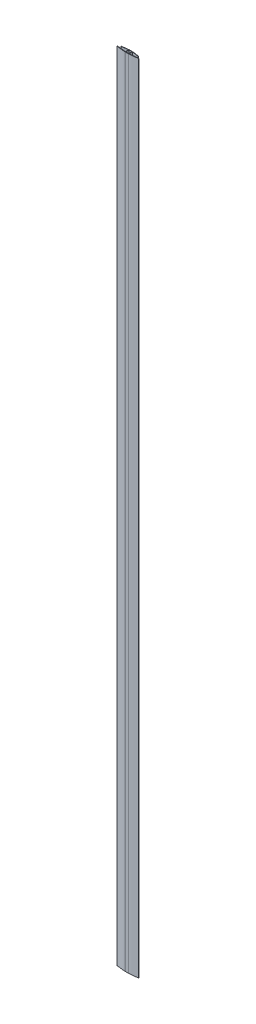
ISO-10303-21;
HEADER;
FILE_DESCRIPTION(('STEP AP214'),'2;1');
FILE_NAME('part.step','',(''),(''),'','','');
FILE_SCHEMA(('AUTOMOTIVE_DESIGN { 1 0 10303 214 1 1 1 1 }'));
ENDSEC;
DATA;
#1=APPLICATION_CONTEXT('core data for automotive mechanical design processes');
#2=APPLICATION_PROTOCOL_DEFINITION('international standard','automotive_design',2000,#1);
#3=PRODUCT_CONTEXT('',#1,'mechanical');
#4=PRODUCT('Part','Part','',(#3));
#5=PRODUCT_RELATED_PRODUCT_CATEGORY('part','',(#4));
#6=PRODUCT_DEFINITION_FORMATION('','',#4);
#7=PRODUCT_DEFINITION_CONTEXT('part definition',#1,'design');
#8=PRODUCT_DEFINITION('design','',#6,#7);
#9=PRODUCT_DEFINITION_SHAPE('','',#8);
#10=(LENGTH_UNIT() NAMED_UNIT(*) SI_UNIT(.MILLI.,.METRE.));
#11=(NAMED_UNIT(*) PLANE_ANGLE_UNIT() SI_UNIT($,.RADIAN.));
#12=(NAMED_UNIT(*) SI_UNIT($,.STERADIAN.) SOLID_ANGLE_UNIT());
#13=UNCERTAINTY_MEASURE_WITH_UNIT(LENGTH_MEASURE(1.E-05),#10,'distance_accuracy_value','');
#14=(GEOMETRIC_REPRESENTATION_CONTEXT(3) GLOBAL_UNCERTAINTY_ASSIGNED_CONTEXT((#13)) GLOBAL_UNIT_ASSIGNED_CONTEXT((#10,
#11,#12)) REPRESENTATION_CONTEXT('',''));
#15=CARTESIAN_POINT('',(0.,0.,0.));
#16=DIRECTION('',(0.,0.,1.));
#17=DIRECTION('',(1.,0.,0.));
#18=AXIS2_PLACEMENT_3D('',#15,#16,#17);
#19=CARTESIAN_POINT('',(15.2507459844548,2693.01,4.6021229374047));
#20=DIRECTION('',(0.,1.,0.));
#21=DIRECTION('',(0.,0.,1.));
#22=AXIS2_PLACEMENT_3D('',#19,#20,#21);
#23=PLANE('',#22);
#24=CARTESIAN_POINT('',(36.,2693.01,2.25));
#25=CARTESIAN_POINT('',(9.4014919689097,2693.01,5.3792458748094));
#26=CARTESIAN_POINT('',(6.2,2693.01,5.4));
#27=B_SPLINE_CURVE_WITH_KNOTS('',2,(#24,#25,#26),.UNSPECIFIED.,.F.,.F.,(3,3),(0.,1.),.UNSPECIFIED.);
#28=CARTESIAN_POINT('',(36.,2693.01,2.25));
#29=VERTEX_POINT('',#28);
#30=CARTESIAN_POINT('',(6.20000000000004,2693.01,5.4));
#31=VERTEX_POINT('',#30);
#32=EDGE_CURVE('E243',#29,#31,#27,.T.);
#33=ORIENTED_EDGE('',*,*,#32,.T.);
#34=DIRECTION('',(0.,0.,-1.));
#35=VECTOR('',#34,1.);
#36=CARTESIAN_POINT('',(6.20000000000004,2693.01,5.4));
#37=LINE('',#36,#35);
#38=CARTESIAN_POINT('',(6.2,2693.01,-5.40000000000002));
#39=VERTEX_POINT('',#38);
#40=EDGE_CURVE('E249',#31,#39,#37,.T.);
#41=ORIENTED_EDGE('',*,*,#40,.T.);
#42=CARTESIAN_POINT('',(6.2,2693.01,-5.40000000000002));
#43=CARTESIAN_POINT('',(9.67922522211832,2693.01,-5.40000000000002));
#44=CARTESIAN_POINT('',(20.1119687118519,2693.01,-3.68143745540401));
#45=CARTESIAN_POINT('',(28.1938480747115,2693.01,-2.0889544938598));
#46=CARTESIAN_POINT('',(29.3222091699546,2693.01,-2.21503407691224));
#47=B_SPLINE_CURVE_WITH_KNOTS('',3,(#42,#43,#44,#45,#46),.UNSPECIFIED.,.F.,.F.,(4,1,4),(0.,
0.484752628193422,0.969505256386843),.UNSPECIFIED.);
#48=CARTESIAN_POINT('',(29.3222091699546,2693.01,-2.21503407691224));
#49=VERTEX_POINT('',#48);
#50=EDGE_CURVE('E255',#39,#49,#47,.T.);
#51=ORIENTED_EDGE('',*,*,#50,.T.);
#52=CARTESIAN_POINT('',(29.3,2693.01,-2.41379713376619));
#53=DIRECTION('',(0.,1.,0.));
#54=DIRECTION('',(0.,0.,1.));
#55=AXIS2_PLACEMENT_3D('',#52,#53,#54);
#56=CIRCLE('',#55,0.199999999999998);
#57=CARTESIAN_POINT('',(29.5,2693.01,-2.41379713376619));
#58=VERTEX_POINT('',#57);
#59=EDGE_CURVE('E260',#49,#58,#56,.T.);
#60=ORIENTED_EDGE('',*,*,#59,.T.);
#61=DIRECTION('',(0.,0.,-1.));
#62=VECTOR('',#61,1.);
#63=CARTESIAN_POINT('',(29.5,2693.01,-3.21146771980356));
#64=LINE('',#63,#62);
#65=CARTESIAN_POINT('',(29.5,2693.01,-3.21146771980356));
#66=VERTEX_POINT('',#65);
#67=EDGE_CURVE('E476',#58,#66,#64,.T.);
#68=ORIENTED_EDGE('',*,*,#67,.T.);
#69=CARTESIAN_POINT('',(29.3,2693.01,-3.21146771980356));
#70=DIRECTION('',(0.,1.,0.));
#71=DIRECTION('',(0.,0.,1.));
#72=AXIS2_PLACEMENT_3D('',#69,#70,#71);
#73=CIRCLE('',#72,0.199999999999996);
#74=CARTESIAN_POINT('',(29.2820884089235,2693.01,-3.4106640423226));
#75=VERTEX_POINT('',#74);
#76=EDGE_CURVE('E478',#66,#75,#73,.T.);
#77=ORIENTED_EDGE('',*,*,#76,.T.);
#78=CARTESIAN_POINT('',(29.2820884089235,2693.01,-3.4106640423226));
#79=CARTESIAN_POINT('',(28.1029389072858,2693.01,-3.30463576115592));
#80=CARTESIAN_POINT('',(20.1691167559138,2693.01,-4.86520668600775));
#81=CARTESIAN_POINT('',(9.20722205309525,2693.01,-6.56590294600874));
#82=CARTESIAN_POINT('',(5.,2693.01,-6.60000000000002));
#83=B_SPLINE_CURVE_WITH_KNOTS('',3,(#78,#79,#80,#81,#82),.UNSPECIFIED.,.F.,.F.,(4,1,4),(0.,
0.481875703247068,0.963751406494135),.UNSPECIFIED.);
#84=CARTESIAN_POINT('',(5.00000000000002,2693.01,-6.59999999999999));
#85=VERTEX_POINT('',#84);
#86=EDGE_CURVE('E479',#75,#85,#83,.T.);
#87=ORIENTED_EDGE('',*,*,#86,.T.);
#88=DIRECTION('',(-1.,0.,0.));
#89=VECTOR('',#88,1.);
#90=CARTESIAN_POINT('',(5.00000000000002,2693.01,-6.59999999999999));
#91=LINE('',#90,#89);
#92=CARTESIAN_POINT('',(-4.99999999999998,2693.01,-6.60000000000002));
#93=VERTEX_POINT('',#92);
#94=EDGE_CURVE('E486',#85,#93,#91,.T.);
#95=ORIENTED_EDGE('',*,*,#94,.T.);
#96=CARTESIAN_POINT('',(-4.99999999999998,2693.01,-6.60000000000002));
#97=CARTESIAN_POINT('',(-9.20722205309523,2693.01,-6.56590294600874));
#98=CARTESIAN_POINT('',(-20.1691167559138,2693.01,-4.86520668600775));
#99=CARTESIAN_POINT('',(-28.1029389072858,2693.01,-3.30463576115592));
#100=CARTESIAN_POINT('',(-29.2820884089235,2693.01,-3.4106640423226));
#101=B_SPLINE_CURVE_WITH_KNOTS('',3,(#96,#97,#98,#99,#100),.UNSPECIFIED.,.F.,.F.,(4,1,4),(0.,
0.481875703247068,0.963751406494135),.UNSPECIFIED.);
#102=CARTESIAN_POINT('',(-29.2820884089235,2693.01,-3.41066404232259));
#103=VERTEX_POINT('',#102);
#104=EDGE_CURVE('E782',#93,#103,#101,.T.);
#105=ORIENTED_EDGE('',*,*,#104,.T.);
#106=CARTESIAN_POINT('',(-29.3,2693.01,-3.21146771980356));
#107=DIRECTION('',(0.,1.,0.));
#108=DIRECTION('',(0.,0.,-1.));
#109=AXIS2_PLACEMENT_3D('',#106,#107,#108);
#110=CIRCLE('',#109,0.199999999999996);
#111=CARTESIAN_POINT('',(-29.5,2693.01,-3.21146771980356));
#112=VERTEX_POINT('',#111);
#113=EDGE_CURVE('E787',#103,#112,#110,.T.);
#114=ORIENTED_EDGE('',*,*,#113,.T.);
#115=DIRECTION('',(0.,0.,1.));
#116=VECTOR('',#115,1.);
#117=CARTESIAN_POINT('',(-29.5,2693.01,-3.21146771980356));
#118=LINE('',#117,#116);
#119=CARTESIAN_POINT('',(-29.5,2693.01,-2.4137971337662));
#120=VERTEX_POINT('',#119);
#121=EDGE_CURVE('E791',#112,#120,#118,.T.);
#122=ORIENTED_EDGE('',*,*,#121,.T.);
#123=CARTESIAN_POINT('',(-29.3,2693.01,-2.4137971337662));
#124=DIRECTION('',(0.,1.,0.));
#125=DIRECTION('',(0.,0.,-1.));
#126=AXIS2_PLACEMENT_3D('',#123,#124,#125);
#127=CIRCLE('',#126,0.199999999999999);
#128=CARTESIAN_POINT('',(-29.3222091699546,2693.01,-2.21503407691224));
#129=VERTEX_POINT('',#128);
#130=EDGE_CURVE('E777',#120,#129,#127,.T.);
#131=ORIENTED_EDGE('',*,*,#130,.T.);
#132=CARTESIAN_POINT('',(-29.3222091699546,2693.01,-2.21503407691224));
#133=CARTESIAN_POINT('',(-28.1938480747115,2693.01,-2.0889544938598));
#134=CARTESIAN_POINT('',(-20.1119687118519,2693.01,-3.68143745540402));
#135=CARTESIAN_POINT('',(-9.67922522211832,2693.01,-5.39999999999999));
#136=CARTESIAN_POINT('',(-6.2,2693.01,-5.39999999999999));
#137=B_SPLINE_CURVE_WITH_KNOTS('',3,(#132,#133,#134,#135,#136),.UNSPECIFIED.,.F.,.F.,(4,1,4),
(0.,0.484752628193422,0.969505256386843),.UNSPECIFIED.);
#138=CARTESIAN_POINT('',(-6.2,2693.01,-5.4));
#139=VERTEX_POINT('',#138);
#140=EDGE_CURVE('E772',#129,#139,#137,.T.);
#141=ORIENTED_EDGE('',*,*,#140,.T.);
#142=DIRECTION('',(0.,0.,1.));
#143=VECTOR('',#142,1.);
#144=CARTESIAN_POINT('',(-6.2,2693.01,5.4));
#145=LINE('',#144,#143);
#146=CARTESIAN_POINT('',(-6.2,2693.01,5.4));
#147=VERTEX_POINT('',#146);
#148=EDGE_CURVE('E767',#139,#147,#145,.T.);
#149=ORIENTED_EDGE('',*,*,#148,.T.);
#150=CARTESIAN_POINT('',(-6.2,2693.01,5.4));
#151=CARTESIAN_POINT('',(-9.4014919689097,2693.01,5.3792458748094));
#152=CARTESIAN_POINT('',(-36.,2693.01,2.25));
#153=B_SPLINE_CURVE_WITH_KNOTS('',2,(#150,#151,#152),.UNSPECIFIED.,.F.,.F.,(3,3),(0.,1.),.UNSPECIFIED.);
#154=CARTESIAN_POINT('',(-36.,2693.01,2.25));
#155=VERTEX_POINT('',#154);
#156=EDGE_CURVE('E762',#147,#155,#153,.T.);
#157=ORIENTED_EDGE('',*,*,#156,.T.);
#158=DIRECTION('',(0.,0.,1.));
#159=VECTOR('',#158,1.);
#160=CARTESIAN_POINT('',(-36.,2693.01,2.25));
#161=LINE('',#160,#159);
#162=CARTESIAN_POINT('',(-36.,2693.01,3.47670712332788));
#163=VERTEX_POINT('',#162);
#164=EDGE_CURVE('E757',#155,#163,#161,.T.);
#165=ORIENTED_EDGE('',*,*,#164,.T.);
#166=CARTESIAN_POINT('',(-36.,2693.01,3.47670712332788));
#167=CARTESIAN_POINT('',(-11.5559973241356,2693.01,6.84995330608567));
#168=CARTESIAN_POINT('',(-5.71495846410562,2693.01,6.62958516518065));
#169=B_SPLINE_CURVE_WITH_KNOTS('',2,(#166,#167,#168),.UNSPECIFIED.,.F.,.F.,(3,3),(0.,1.),.UNSPECIFIED.);
#170=CARTESIAN_POINT('',(-5.71495846410562,2693.01,6.62958516518065));
#171=VERTEX_POINT('',#170);
#172=EDGE_CURVE('E750',#163,#171,#169,.T.);
#173=ORIENTED_EDGE('',*,*,#172,.T.);
#174=DIRECTION('',(0.999144935109841,0.,-0.0413448744628939));
#175=VECTOR('',#174,1.);
#176=CARTESIAN_POINT('',(-4.99999999999996,2693.01,6.6));
#177=LINE('',#176,#175);
#178=CARTESIAN_POINT('',(-4.99999999999996,2693.01,6.6));
#179=VERTEX_POINT('',#178);
#180=EDGE_CURVE('E749',#171,#179,#177,.T.);
#181=ORIENTED_EDGE('',*,*,#180,.T.);
#182=DIRECTION('',(1.,0.,0.));
#183=VECTOR('',#182,1.);
#184=CARTESIAN_POINT('',(-4.99999999999996,2693.01,6.6));
#185=LINE('',#184,#183);
#186=CARTESIAN_POINT('',(5.,2693.01,6.6));
#187=VERTEX_POINT('',#186);
#188=EDGE_CURVE('E748',#179,#187,#185,.T.);
#189=ORIENTED_EDGE('',*,*,#188,.T.);
#190=DIRECTION('',(0.99914493510984,0.,0.0413448744628973));
#191=VECTOR('',#190,1.);
#192=CARTESIAN_POINT('',(5.,2693.01,6.6));
#193=LINE('',#192,#191);
#194=CARTESIAN_POINT('',(5.71495846410562,2693.01,6.62958516518065));
#195=VERTEX_POINT('',#194);
#196=EDGE_CURVE('E309',#187,#195,#193,.T.);
#197=ORIENTED_EDGE('',*,*,#196,.T.);
#198=CARTESIAN_POINT('',(5.71495846410562,2693.01,6.62958516518065));
#199=CARTESIAN_POINT('',(11.5559973241356,2693.01,6.84995330608567));
#200=CARTESIAN_POINT('',(36.,2693.01,3.47670712332788));
#201=B_SPLINE_CURVE_WITH_KNOTS('',2,(#198,#199,#200),.UNSPECIFIED.,.F.,.F.,(3,3),(0.,1.),.UNSPECIFIED.);
#202=CARTESIAN_POINT('',(36.,2693.01,3.47670712332788));
#203=VERTEX_POINT('',#202);
#204=EDGE_CURVE('E302',#195,#203,#201,.T.);
#205=ORIENTED_EDGE('',*,*,#204,.T.);
#206=DIRECTION('',(0.,0.,-1.));
#207=VECTOR('',#206,1.);
#208=CARTESIAN_POINT('',(36.,2693.01,2.25));
#209=LINE('',#208,#207);
#210=EDGE_CURVE('E308',#203,#29,#209,.T.);
#211=ORIENTED_EDGE('',*,*,#210,.T.);
#212=EDGE_LOOP('',(#33,#41,#51,#60,#68,#77,#87,#95,#105,#114,#122,#131,#141,#149,#157,#165,#173,
#181,#189,#197,#205,#211));
#213=FACE_BOUND('',#212,.T.);
#214=DIRECTION('',(0.,0.,-1.));
#215=VECTOR('',#214,1.);
#216=CARTESIAN_POINT('',(5.00000000000002,2693.01,5.4));
#217=LINE('',#216,#215);
#218=CARTESIAN_POINT('',(5.00000000000002,2693.01,5.4));
#219=VERTEX_POINT('',#218);
#220=CARTESIAN_POINT('',(5.00000000000002,2693.01,-5.39999999999999));
#221=VERTEX_POINT('',#220);
#222=EDGE_CURVE('E213',#219,#221,#217,.T.);
#223=ORIENTED_EDGE('',*,*,#222,.F.);
#224=DIRECTION('',(1.,0.,0.));
#225=VECTOR('',#224,1.);
#226=CARTESIAN_POINT('',(-4.99999999999998,2693.01,5.4));
#227=LINE('',#226,#225);
#228=CARTESIAN_POINT('',(-4.99999999999998,2693.01,5.4));
#229=VERTEX_POINT('',#228);
#230=EDGE_CURVE('E205',#229,#219,#227,.T.);
#231=ORIENTED_EDGE('',*,*,#230,.F.);
#232=DIRECTION('',(0.,0.,1.));
#233=VECTOR('',#232,1.);
#234=CARTESIAN_POINT('',(-4.99999999999998,2693.01,5.4));
#235=LINE('',#234,#233);
#236=CARTESIAN_POINT('',(-4.99999999999998,2693.01,-5.4));
#237=VERTEX_POINT('',#236);
#238=EDGE_CURVE('E229',#237,#229,#235,.T.);
#239=ORIENTED_EDGE('',*,*,#238,.F.);
#240=DIRECTION('',(-1.,0.,0.));
#241=VECTOR('',#240,1.);
#242=CARTESIAN_POINT('',(5.00000000000002,2693.01,-5.39999999999999));
#243=LINE('',#242,#241);
#244=EDGE_CURVE('E227',#221,#237,#243,.T.);
#245=ORIENTED_EDGE('',*,*,#244,.F.);
#246=EDGE_LOOP('',(#223,#231,#239,#245));
#247=FACE_BOUND('',#246,.T.);
#248=ADVANCED_FACE('F33',(#213,#247),#23,.T.);
#249=CARTESIAN_POINT('',(15.2507459844548,0.,4.6021229374047));
#250=DIRECTION('',(0.,1.,0.));
#251=DIRECTION('',(0.,0.,1.));
#252=AXIS2_PLACEMENT_3D('',#249,#250,#251);
#253=PLANE('',#252);
#254=CARTESIAN_POINT('',(36.,0.,2.25));
#255=CARTESIAN_POINT('',(9.4014919689097,0.,5.3792458748094));
#256=CARTESIAN_POINT('',(6.2,0.,5.4));
#257=B_SPLINE_CURVE_WITH_KNOTS('',2,(#254,#255,#256),.UNSPECIFIED.,.F.,.F.,(3,3),(0.,1.),.UNSPECIFIED.);
#258=CARTESIAN_POINT('',(36.,0.,2.25));
#259=VERTEX_POINT('',#258);
#260=CARTESIAN_POINT('',(6.20000000000004,0.,5.4));
#261=VERTEX_POINT('',#260);
#262=EDGE_CURVE('E223',#259,#261,#257,.T.);
#263=ORIENTED_EDGE('',*,*,#262,.F.);
#264=DIRECTION('',(0.,0.,-1.));
#265=VECTOR('',#264,1.);
#266=CARTESIAN_POINT('',(36.,0.,2.25));
#267=LINE('',#266,#265);
#268=CARTESIAN_POINT('',(36.,0.,3.47670712332788));
#269=VERTEX_POINT('',#268);
#270=EDGE_CURVE('E250',#269,#259,#267,.T.);
#271=ORIENTED_EDGE('',*,*,#270,.F.);
#272=CARTESIAN_POINT('',(5.71495846410562,0.,6.62958516518065));
#273=CARTESIAN_POINT('',(11.5559973241356,0.,6.84995330608567));
#274=CARTESIAN_POINT('',(36.,0.,3.47670712332788));
#275=B_SPLINE_CURVE_WITH_KNOTS('',2,(#272,#273,#274),.UNSPECIFIED.,.F.,.F.,(3,3),(0.,1.),.UNSPECIFIED.);
#276=CARTESIAN_POINT('',(5.71495846410562,0.,6.62958516518065));
#277=VERTEX_POINT('',#276);
#278=EDGE_CURVE('E393',#277,#269,#275,.T.);
#279=ORIENTED_EDGE('',*,*,#278,.F.);
#280=DIRECTION('',(0.99914493510984,0.,0.0413448744628973));
#281=VECTOR('',#280,1.);
#282=CARTESIAN_POINT('',(5.,0.,6.6));
#283=LINE('',#282,#281);
#284=CARTESIAN_POINT('',(5.,0.,6.6));
#285=VERTEX_POINT('',#284);
#286=EDGE_CURVE('E391',#285,#277,#283,.T.);
#287=ORIENTED_EDGE('',*,*,#286,.F.);
#288=DIRECTION('',(1.,0.,0.));
#289=VECTOR('',#288,1.);
#290=CARTESIAN_POINT('',(5.,0.,6.6));
#291=LINE('',#290,#289);
#292=CARTESIAN_POINT('',(-4.99999999999996,0.,6.6));
#293=VERTEX_POINT('',#292);
#294=EDGE_CURVE('E389',#293,#285,#291,.T.);
#295=ORIENTED_EDGE('',*,*,#294,.F.);
#296=DIRECTION('',(0.999144935109841,0.,-0.0413448744628939));
#297=VECTOR('',#296,1.);
#298=CARTESIAN_POINT('',(-4.99999999999996,0.,6.6));
#299=LINE('',#298,#297);
#300=CARTESIAN_POINT('',(-5.71495846410562,0.,6.62958516518065));
#301=VERTEX_POINT('',#300);
#302=EDGE_CURVE('E383',#301,#293,#299,.T.);
#303=ORIENTED_EDGE('',*,*,#302,.F.);
#304=CARTESIAN_POINT('',(-36.,0.,3.47670712332788));
#305=CARTESIAN_POINT('',(-11.5559973241356,0.,6.84995330608567));
#306=CARTESIAN_POINT('',(-5.71495846410562,0.,6.62958516518065));
#307=B_SPLINE_CURVE_WITH_KNOTS('',2,(#304,#305,#306),.UNSPECIFIED.,.F.,.F.,(3,3),(0.,1.),.UNSPECIFIED.);
#308=CARTESIAN_POINT('',(-36.,0.,3.47670712332788));
#309=VERTEX_POINT('',#308);
#310=EDGE_CURVE('E379',#309,#301,#307,.T.);
#311=ORIENTED_EDGE('',*,*,#310,.F.);
#312=DIRECTION('',(0.,0.,1.));
#313=VECTOR('',#312,1.);
#314=CARTESIAN_POINT('',(-36.,0.,2.25));
#315=LINE('',#314,#313);
#316=CARTESIAN_POINT('',(-36.,0.,2.25));
#317=VERTEX_POINT('',#316);
#318=EDGE_CURVE('E374',#317,#309,#315,.T.);
#319=ORIENTED_EDGE('',*,*,#318,.F.);
#320=CARTESIAN_POINT('',(-6.2,0.,5.4));
#321=CARTESIAN_POINT('',(-9.4014919689097,0.,5.3792458748094));
#322=CARTESIAN_POINT('',(-36.,0.,2.25));
#323=B_SPLINE_CURVE_WITH_KNOTS('',2,(#320,#321,#322),.UNSPECIFIED.,.F.,.F.,(3,3),(0.,1.),.UNSPECIFIED.);
#324=CARTESIAN_POINT('',(-6.2,0.,5.4));
#325=VERTEX_POINT('',#324);
#326=EDGE_CURVE('E370',#325,#317,#323,.T.);
#327=ORIENTED_EDGE('',*,*,#326,.F.);
#328=DIRECTION('',(0.,0.,1.));
#329=VECTOR('',#328,1.);
#330=CARTESIAN_POINT('',(-6.2,0.,5.4));
#331=LINE('',#330,#329);
#332=CARTESIAN_POINT('',(-6.2,0.,-5.4));
#333=VERTEX_POINT('',#332);
#334=EDGE_CURVE('E365',#333,#325,#331,.T.);
#335=ORIENTED_EDGE('',*,*,#334,.F.);
#336=CARTESIAN_POINT('',(-29.3222091699546,0.,-2.21503407691224));
#337=CARTESIAN_POINT('',(-28.1938480747115,0.,-2.0889544938598));
#338=CARTESIAN_POINT('',(-20.1119687118519,0.,-3.68143745540402));
#339=CARTESIAN_POINT('',(-9.67922522211832,0.,-5.39999999999999));
#340=CARTESIAN_POINT('',(-6.2,0.,-5.39999999999999));
#341=B_SPLINE_CURVE_WITH_KNOTS('',3,(#336,#337,#338,#339,#340),.UNSPECIFIED.,.F.,.F.,(4,1,4),
(0.,0.484752628193422,0.969505256386843),.UNSPECIFIED.);
#342=CARTESIAN_POINT('',(-29.3222091699546,0.,-2.21503407691224));
#343=VERTEX_POINT('',#342);
#344=EDGE_CURVE('E361',#343,#333,#341,.T.);
#345=ORIENTED_EDGE('',*,*,#344,.F.);
#346=CARTESIAN_POINT('',(-29.3,0.,-2.4137971337662));
#347=DIRECTION('',(0.,1.,0.));
#348=DIRECTION('',(0.,0.,-1.));
#349=AXIS2_PLACEMENT_3D('',#346,#347,#348);
#350=CIRCLE('',#349,0.199999999999999);
#351=CARTESIAN_POINT('',(-29.5,0.,-2.4137971337662));
#352=VERTEX_POINT('',#351);
#353=EDGE_CURVE('E359',#352,#343,#350,.T.);
#354=ORIENTED_EDGE('',*,*,#353,.F.);
#355=DIRECTION('',(0.,0.,1.));
#356=VECTOR('',#355,1.);
#357=CARTESIAN_POINT('',(-29.5,0.,-3.21146771980356));
#358=LINE('',#357,#356);
#359=CARTESIAN_POINT('',(-29.5,0.,-3.21146771980356));
#360=VERTEX_POINT('',#359);
#361=EDGE_CURVE('E357',#360,#352,#358,.T.);
#362=ORIENTED_EDGE('',*,*,#361,.F.);
#363=CARTESIAN_POINT('',(-29.3,0.,-3.21146771980356));
#364=DIRECTION('',(0.,1.,0.));
#365=DIRECTION('',(0.,0.,-1.));
#366=AXIS2_PLACEMENT_3D('',#363,#364,#365);
#367=CIRCLE('',#366,0.199999999999996);
#368=CARTESIAN_POINT('',(-29.2820884089235,0.,-3.41066404232259));
#369=VERTEX_POINT('',#368);
#370=EDGE_CURVE('E352',#369,#360,#367,.T.);
#371=ORIENTED_EDGE('',*,*,#370,.F.);
#372=CARTESIAN_POINT('',(-4.99999999999998,0.,-6.60000000000002));
#373=CARTESIAN_POINT('',(-9.20722205309523,0.,-6.56590294600874));
#374=CARTESIAN_POINT('',(-20.1691167559138,0.,-4.86520668600775));
#375=CARTESIAN_POINT('',(-28.1029389072858,0.,-3.30463576115592));
#376=CARTESIAN_POINT('',(-29.2820884089235,0.,-3.4106640423226));
#377=B_SPLINE_CURVE_WITH_KNOTS('',3,(#372,#373,#374,#375,#376),.UNSPECIFIED.,.F.,.F.,(4,1,4),
(0.,0.481875703247068,0.963751406494135),.UNSPECIFIED.);
#378=CARTESIAN_POINT('',(-4.99999999999998,0.,-6.60000000000002));
#379=VERTEX_POINT('',#378);
#380=EDGE_CURVE('E348',#379,#369,#377,.T.);
#381=ORIENTED_EDGE('',*,*,#380,.F.);
#382=DIRECTION('',(-1.,0.,0.));
#383=VECTOR('',#382,1.);
#384=CARTESIAN_POINT('',(-4.99999999999998,0.,-6.6));
#385=LINE('',#384,#383);
#386=CARTESIAN_POINT('',(5.00000000000002,0.,-6.59999999999999));
#387=VERTEX_POINT('',#386);
#388=EDGE_CURVE('E343',#387,#379,#385,.T.);
#389=ORIENTED_EDGE('',*,*,#388,.F.);
#390=CARTESIAN_POINT('',(29.2820884089235,0.,-3.4106640423226));
#391=CARTESIAN_POINT('',(28.1029389072858,0.,-3.30463576115592));
#392=CARTESIAN_POINT('',(20.1691167559138,0.,-4.86520668600775));
#393=CARTESIAN_POINT('',(9.20722205309525,0.,-6.56590294600874));
#394=CARTESIAN_POINT('',(5.,0.,-6.60000000000002));
#395=B_SPLINE_CURVE_WITH_KNOTS('',3,(#390,#391,#392,#393,#394),.UNSPECIFIED.,.F.,.F.,(4,1,4),
(0.,0.481875703247068,0.963751406494135),.UNSPECIFIED.);
#396=CARTESIAN_POINT('',(29.2820884089235,0.,-3.4106640423226));
#397=VERTEX_POINT('',#396);
#398=EDGE_CURVE('E338',#397,#387,#395,.T.);
#399=ORIENTED_EDGE('',*,*,#398,.F.);
#400=CARTESIAN_POINT('',(29.3,0.,-3.21146771980356));
#401=DIRECTION('',(0.,1.,0.));
#402=DIRECTION('',(0.,0.,1.));
#403=AXIS2_PLACEMENT_3D('',#400,#401,#402);
#404=CIRCLE('',#403,0.199999999999996);
#405=CARTESIAN_POINT('',(29.5,0.,-3.21146771980356));
#406=VERTEX_POINT('',#405);
#407=EDGE_CURVE('E336',#406,#397,#404,.T.);
#408=ORIENTED_EDGE('',*,*,#407,.F.);
#409=DIRECTION('',(0.,0.,-1.));
#410=VECTOR('',#409,1.);
#411=CARTESIAN_POINT('',(29.5,0.,-3.21146771980356));
#412=LINE('',#411,#410);
#413=CARTESIAN_POINT('',(29.5,0.,-2.41379713376619));
#414=VERTEX_POINT('',#413);
#415=EDGE_CURVE('E334',#414,#406,#412,.T.);
#416=ORIENTED_EDGE('',*,*,#415,.F.);
#417=CARTESIAN_POINT('',(29.3,0.,-2.41379713376619));
#418=DIRECTION('',(0.,1.,0.));
#419=DIRECTION('',(0.,0.,1.));
#420=AXIS2_PLACEMENT_3D('',#417,#418,#419);
#421=CIRCLE('',#420,0.199999999999998);
#422=CARTESIAN_POINT('',(29.3222091699546,0.,-2.21503407691224));
#423=VERTEX_POINT('',#422);
#424=EDGE_CURVE('E329',#423,#414,#421,.T.);
#425=ORIENTED_EDGE('',*,*,#424,.F.);
#426=CARTESIAN_POINT('',(6.2,0.,-5.40000000000002));
#427=CARTESIAN_POINT('',(9.67922522211832,0.,-5.40000000000002));
#428=CARTESIAN_POINT('',(20.1119687118519,0.,-3.68143745540401));
#429=CARTESIAN_POINT('',(28.1938480747115,0.,-2.0889544938598));
#430=CARTESIAN_POINT('',(29.3222091699546,0.,-2.21503407691224));
#431=B_SPLINE_CURVE_WITH_KNOTS('',3,(#426,#427,#428,#429,#430),.UNSPECIFIED.,.F.,.F.,(4,1,4),
(0.,0.484752628193422,0.969505256386843),.UNSPECIFIED.);
#432=CARTESIAN_POINT('',(6.2,0.,-5.40000000000002));
#433=VERTEX_POINT('',#432);
#434=EDGE_CURVE('E325',#433,#423,#431,.T.);
#435=ORIENTED_EDGE('',*,*,#434,.F.);
#436=DIRECTION('',(0.,0.,-1.));
#437=VECTOR('',#436,1.);
#438=CARTESIAN_POINT('',(6.20000000000004,0.,5.4));
#439=LINE('',#438,#437);
#440=EDGE_CURVE('E320',#261,#433,#439,.T.);
#441=ORIENTED_EDGE('',*,*,#440,.F.);
#442=EDGE_LOOP('',(#263,#271,#279,#287,#295,#303,#311,#319,#327,#335,#345,#354,#362,#371,#381,
#389,#399,#408,#416,#425,#435,#441));
#443=FACE_BOUND('',#442,.T.);
#444=DIRECTION('',(1.,0.,0.));
#445=VECTOR('',#444,1.);
#446=CARTESIAN_POINT('',(5.00000000000002,0.,5.4));
#447=LINE('',#446,#445);
#448=CARTESIAN_POINT('',(-4.99999999999998,0.,5.4));
#449=VERTEX_POINT('',#448);
#450=CARTESIAN_POINT('',(5.00000000000002,0.,5.4));
#451=VERTEX_POINT('',#450);
#452=EDGE_CURVE('E233',#449,#451,#447,.T.);
#453=ORIENTED_EDGE('',*,*,#452,.T.);
#454=DIRECTION('',(0.,0.,-1.));
#455=VECTOR('',#454,1.);
#456=CARTESIAN_POINT('',(5.00000000000002,0.,5.4));
#457=LINE('',#456,#455);
#458=CARTESIAN_POINT('',(5.00000000000002,0.,-5.39999999999999));
#459=VERTEX_POINT('',#458);
#460=EDGE_CURVE('E221',#451,#459,#457,.T.);
#461=ORIENTED_EDGE('',*,*,#460,.T.);
#462=DIRECTION('',(-1.,0.,0.));
#463=VECTOR('',#462,1.);
#464=CARTESIAN_POINT('',(-4.99999999999998,0.,-5.4));
#465=LINE('',#464,#463);
#466=CARTESIAN_POINT('',(-4.99999999999998,0.,-5.4));
#467=VERTEX_POINT('',#466);
#468=EDGE_CURVE('E236',#459,#467,#465,.T.);
#469=ORIENTED_EDGE('',*,*,#468,.T.);
#470=DIRECTION('',(0.,0.,1.));
#471=VECTOR('',#470,1.);
#472=CARTESIAN_POINT('',(-4.99999999999998,0.,5.4));
#473=LINE('',#472,#471);
#474=EDGE_CURVE('E214',#467,#449,#473,.T.);
#475=ORIENTED_EDGE('',*,*,#474,.T.);
#476=EDGE_LOOP('',(#453,#461,#469,#475));
#477=FACE_BOUND('',#476,.T.);
#478=ADVANCED_FACE('F278',(#443,#477),#253,.F.);
#479=DIRECTION('',(0.,-1.,0.));
#480=VECTOR('',#479,1.);
#481=SURFACE_OF_LINEAR_EXTRUSION('',#27,#480);
#482=ORIENTED_EDGE('',*,*,#262,.T.);
#483=DIRECTION('',(0.,-1.,0.));
#484=VECTOR('',#483,1.);
#485=CARTESIAN_POINT('',(6.20000000000004,2693.01,5.4));
#486=LINE('',#485,#484);
#487=EDGE_CURVE('E11',#31,#261,#486,.T.);
#488=ORIENTED_EDGE('',*,*,#487,.F.);
#489=ORIENTED_EDGE('',*,*,#32,.F.);
#490=DIRECTION('',(0.,-1.,0.));
#491=VECTOR('',#490,1.);
#492=CARTESIAN_POINT('',(36.,2693.01,2.25));
#493=LINE('',#492,#491);
#494=EDGE_CURVE('E315',#29,#259,#493,.T.);
#495=ORIENTED_EDGE('',*,*,#494,.T.);
#496=EDGE_LOOP('',(#482,#488,#489,#495));
#497=FACE_BOUND('',#496,.T.);
#498=ADVANCED_FACE('F35',(#497),#481,.F.);
#499=CARTESIAN_POINT('',(6.20000000000004,2693.01,5.4));
#500=DIRECTION('',(-1.,0.,0.));
#501=DIRECTION('',(0.,0.,1.));
#502=AXIS2_PLACEMENT_3D('',#499,#500,#501);
#503=PLANE('',#502);
#504=ORIENTED_EDGE('',*,*,#440,.T.);
#505=DIRECTION('',(0.,-1.,0.));
#506=VECTOR('',#505,1.);
#507=CARTESIAN_POINT('',(6.2,2693.01,-5.40000000000002));
#508=LINE('',#507,#506);
#509=EDGE_CURVE('E42',#39,#433,#508,.T.);
#510=ORIENTED_EDGE('',*,*,#509,.F.);
#511=ORIENTED_EDGE('',*,*,#40,.F.);
#512=ORIENTED_EDGE('',*,*,#487,.T.);
#513=EDGE_LOOP('',(#504,#510,#511,#512));
#514=FACE_BOUND('',#513,.T.);
#515=ADVANCED_FACE('F270',(#514),#503,.F.);
#516=DIRECTION('',(0.,-1.,0.));
#517=VECTOR('',#516,1.);
#518=SURFACE_OF_LINEAR_EXTRUSION('',#47,#517);
#519=ORIENTED_EDGE('',*,*,#434,.T.);
#520=DIRECTION('',(0.,-1.,0.));
#521=VECTOR('',#520,1.);
#522=CARTESIAN_POINT('',(29.3222091699546,2693.01,-2.21503407691224));
#523=LINE('',#522,#521);
#524=EDGE_CURVE('E457',#49,#423,#523,.T.);
#525=ORIENTED_EDGE('',*,*,#524,.F.);
#526=ORIENTED_EDGE('',*,*,#50,.F.);
#527=ORIENTED_EDGE('',*,*,#509,.T.);
#528=EDGE_LOOP('',(#519,#525,#526,#527));
#529=FACE_BOUND('',#528,.T.);
#530=ADVANCED_FACE('F266',(#529),#518,.F.);
#531=CARTESIAN_POINT('',(29.3,2693.01,-2.41379713376619));
#532=DIRECTION('',(0.,-1.,0.));
#533=DIRECTION('',(0.,0.,-1.));
#534=AXIS2_PLACEMENT_3D('',#531,#532,#533);
#535=CYLINDRICAL_SURFACE('',#534,0.199999999999998);
#536=ORIENTED_EDGE('',*,*,#424,.T.);
#537=DIRECTION('',(0.,-1.,0.));
#538=VECTOR('',#537,1.);
#539=CARTESIAN_POINT('',(29.5,2693.01,-2.41379713376619));
#540=LINE('',#539,#538);
#541=EDGE_CURVE('E454',#58,#414,#540,.T.);
#542=ORIENTED_EDGE('',*,*,#541,.F.);
#543=ORIENTED_EDGE('',*,*,#59,.F.);
#544=ORIENTED_EDGE('',*,*,#524,.T.);
#545=EDGE_LOOP('',(#536,#542,#543,#544));
#546=FACE_BOUND('',#545,.T.);
#547=ADVANCED_FACE('F269',(#546),#535,.T.);
#548=CARTESIAN_POINT('',(29.5,2693.01,-3.21146771980356));
#549=DIRECTION('',(-1.,0.,0.));
#550=DIRECTION('',(0.,0.,1.));
#551=AXIS2_PLACEMENT_3D('',#548,#549,#550);
#552=PLANE('',#551);
#553=ORIENTED_EDGE('',*,*,#415,.T.);
#554=DIRECTION('',(0.,-1.,0.));
#555=VECTOR('',#554,1.);
#556=CARTESIAN_POINT('',(29.5,2693.01,-3.21146771980356));
#557=LINE('',#556,#555);
#558=EDGE_CURVE('E451',#66,#406,#557,.T.);
#559=ORIENTED_EDGE('',*,*,#558,.F.);
#560=ORIENTED_EDGE('',*,*,#67,.F.);
#561=ORIENTED_EDGE('',*,*,#541,.T.);
#562=EDGE_LOOP('',(#553,#559,#560,#561));
#563=FACE_BOUND('',#562,.T.);
#564=ADVANCED_FACE('F474',(#563),#552,.F.);
#565=CARTESIAN_POINT('',(29.3,2693.01,-3.21146771980356));
#566=DIRECTION('',(0.,-1.,0.));
#567=DIRECTION('',(0.,0.,-1.));
#568=AXIS2_PLACEMENT_3D('',#565,#566,#567);
#569=CYLINDRICAL_SURFACE('',#568,0.199999999999996);
#570=ORIENTED_EDGE('',*,*,#407,.T.);
#571=DIRECTION('',(0.,-1.,0.));
#572=VECTOR('',#571,1.);
#573=CARTESIAN_POINT('',(29.2820884089235,2693.01,-3.4106640423226));
#574=LINE('',#573,#572);
#575=EDGE_CURVE('E448',#75,#397,#574,.T.);
#576=ORIENTED_EDGE('',*,*,#575,.F.);
#577=ORIENTED_EDGE('',*,*,#76,.F.);
#578=ORIENTED_EDGE('',*,*,#558,.T.);
#579=EDGE_LOOP('',(#570,#576,#577,#578));
#580=FACE_BOUND('',#579,.T.);
#581=ADVANCED_FACE('F497',(#580),#569,.T.);
#582=DIRECTION('',(0.,-1.,0.));
#583=VECTOR('',#582,1.);
#584=SURFACE_OF_LINEAR_EXTRUSION('',#83,#583);
#585=ORIENTED_EDGE('',*,*,#398,.T.);
#586=DIRECTION('',(0.,-1.,0.));
#587=VECTOR('',#586,1.);
#588=CARTESIAN_POINT('',(5.00000000000002,2693.01,-6.59999999999999));
#589=LINE('',#588,#587);
#590=EDGE_CURVE('E445',#85,#387,#589,.T.);
#591=ORIENTED_EDGE('',*,*,#590,.F.);
#592=ORIENTED_EDGE('',*,*,#86,.F.);
#593=ORIENTED_EDGE('',*,*,#575,.T.);
#594=EDGE_LOOP('',(#585,#591,#592,#593));
#595=FACE_BOUND('',#594,.T.);
#596=ADVANCED_FACE('F492',(#595),#584,.F.);
#597=CARTESIAN_POINT('',(-4.99999999999998,2693.01,-6.6));
#598=DIRECTION('',(0.,0.,1.));
#599=DIRECTION('',(1.,0.,0.));
#600=AXIS2_PLACEMENT_3D('',#597,#598,#599);
#601=PLANE('',#600);
#602=ORIENTED_EDGE('',*,*,#388,.T.);
#603=DIRECTION('',(0.,-1.,0.));
#604=VECTOR('',#603,1.);
#605=CARTESIAN_POINT('',(-4.99999999999998,2693.01,-6.60000000000002));
#606=LINE('',#605,#604);
#607=EDGE_CURVE('E442',#93,#379,#606,.T.);
#608=ORIENTED_EDGE('',*,*,#607,.F.);
#609=ORIENTED_EDGE('',*,*,#94,.F.);
#610=ORIENTED_EDGE('',*,*,#590,.T.);
#611=EDGE_LOOP('',(#602,#608,#609,#610));
#612=FACE_BOUND('',#611,.T.);
#613=ADVANCED_FACE('F496',(#612),#601,.F.);
#614=DIRECTION('',(0.,-1.,0.));
#615=VECTOR('',#614,1.);
#616=SURFACE_OF_LINEAR_EXTRUSION('',#101,#615);
#617=ORIENTED_EDGE('',*,*,#380,.T.);
#618=DIRECTION('',(0.,-1.,0.));
#619=VECTOR('',#618,1.);
#620=CARTESIAN_POINT('',(-29.2820884089235,2693.01,-3.41066404232259));
#621=LINE('',#620,#619);
#622=EDGE_CURVE('E439',#103,#369,#621,.T.);
#623=ORIENTED_EDGE('',*,*,#622,.F.);
#624=ORIENTED_EDGE('',*,*,#104,.F.);
#625=ORIENTED_EDGE('',*,*,#607,.T.);
#626=EDGE_LOOP('',(#617,#623,#624,#625));
#627=FACE_BOUND('',#626,.T.);
#628=ADVANCED_FACE('F558',(#627),#616,.F.);
#629=CARTESIAN_POINT('',(-29.3,2693.01,-3.21146771980356));
#630=DIRECTION('',(0.,-1.,0.));
#631=DIRECTION('',(0.,0.,-1.));
#632=AXIS2_PLACEMENT_3D('',#629,#630,#631);
#633=CYLINDRICAL_SURFACE('',#632,0.199999999999996);
#634=ORIENTED_EDGE('',*,*,#370,.T.);
#635=DIRECTION('',(0.,-1.,0.));
#636=VECTOR('',#635,1.);
#637=CARTESIAN_POINT('',(-29.5,2693.01,-3.21146771980356));
#638=LINE('',#637,#636);
#639=EDGE_CURVE('E436',#112,#360,#638,.T.);
#640=ORIENTED_EDGE('',*,*,#639,.F.);
#641=ORIENTED_EDGE('',*,*,#113,.F.);
#642=ORIENTED_EDGE('',*,*,#622,.T.);
#643=EDGE_LOOP('',(#634,#640,#641,#642));
#644=FACE_BOUND('',#643,.T.);
#645=ADVANCED_FACE('F569',(#644),#633,.T.);
#646=CARTESIAN_POINT('',(-29.5,2693.01,-3.21146771980356));
#647=DIRECTION('',(1.,0.,0.));
#648=DIRECTION('',(0.,0.,-1.));
#649=AXIS2_PLACEMENT_3D('',#646,#647,#648);
#650=PLANE('',#649);
#651=ORIENTED_EDGE('',*,*,#361,.T.);
#652=DIRECTION('',(0.,-1.,0.));
#653=VECTOR('',#652,1.);
#654=CARTESIAN_POINT('',(-29.5,2693.01,-2.4137971337662));
#655=LINE('',#654,#653);
#656=EDGE_CURVE('E433',#120,#352,#655,.T.);
#657=ORIENTED_EDGE('',*,*,#656,.F.);
#658=ORIENTED_EDGE('',*,*,#121,.F.);
#659=ORIENTED_EDGE('',*,*,#639,.T.);
#660=EDGE_LOOP('',(#651,#657,#658,#659));
#661=FACE_BOUND('',#660,.T.);
#662=ADVANCED_FACE('F577',(#661),#650,.F.);
#663=CARTESIAN_POINT('',(-29.3,2693.01,-2.4137971337662));
#664=DIRECTION('',(0.,-1.,0.));
#665=DIRECTION('',(0.,0.,-1.));
#666=AXIS2_PLACEMENT_3D('',#663,#664,#665);
#667=CYLINDRICAL_SURFACE('',#666,0.199999999999999);
#668=ORIENTED_EDGE('',*,*,#353,.T.);
#669=DIRECTION('',(0.,-1.,0.));
#670=VECTOR('',#669,1.);
#671=CARTESIAN_POINT('',(-29.3222091699546,2693.01,-2.21503407691224));
#672=LINE('',#671,#670);
#673=EDGE_CURVE('E430',#129,#343,#672,.T.);
#674=ORIENTED_EDGE('',*,*,#673,.F.);
#675=ORIENTED_EDGE('',*,*,#130,.F.);
#676=ORIENTED_EDGE('',*,*,#656,.T.);
#677=EDGE_LOOP('',(#668,#674,#675,#676));
#678=FACE_BOUND('',#677,.T.);
#679=ADVANCED_FACE('F586',(#678),#667,.T.);
#680=DIRECTION('',(0.,-1.,0.));
#681=VECTOR('',#680,1.);
#682=SURFACE_OF_LINEAR_EXTRUSION('',#137,#681);
#683=ORIENTED_EDGE('',*,*,#344,.T.);
#684=DIRECTION('',(0.,-1.,0.));
#685=VECTOR('',#684,1.);
#686=CARTESIAN_POINT('',(-6.2,2693.01,-5.4));
#687=LINE('',#686,#685);
#688=EDGE_CURVE('E427',#139,#333,#687,.T.);
#689=ORIENTED_EDGE('',*,*,#688,.F.);
#690=ORIENTED_EDGE('',*,*,#140,.F.);
#691=ORIENTED_EDGE('',*,*,#673,.T.);
#692=EDGE_LOOP('',(#683,#689,#690,#691));
#693=FACE_BOUND('',#692,.T.);
#694=ADVANCED_FACE('F595',(#693),#682,.F.);
#695=CARTESIAN_POINT('',(-6.2,2693.01,5.4));
#696=DIRECTION('',(1.,0.,0.));
#697=DIRECTION('',(0.,0.,-1.));
#698=AXIS2_PLACEMENT_3D('',#695,#696,#697);
#699=PLANE('',#698);
#700=ORIENTED_EDGE('',*,*,#334,.T.);
#701=DIRECTION('',(0.,-1.,0.));
#702=VECTOR('',#701,1.);
#703=CARTESIAN_POINT('',(-6.2,2693.01,5.4));
#704=LINE('',#703,#702);
#705=EDGE_CURVE('E424',#147,#325,#704,.T.);
#706=ORIENTED_EDGE('',*,*,#705,.F.);
#707=ORIENTED_EDGE('',*,*,#148,.F.);
#708=ORIENTED_EDGE('',*,*,#688,.T.);
#709=EDGE_LOOP('',(#700,#706,#707,#708));
#710=FACE_BOUND('',#709,.T.);
#711=ADVANCED_FACE('F604',(#710),#699,.F.);
#712=DIRECTION('',(0.,-1.,0.));
#713=VECTOR('',#712,1.);
#714=SURFACE_OF_LINEAR_EXTRUSION('',#153,#713);
#715=ORIENTED_EDGE('',*,*,#326,.T.);
#716=DIRECTION('',(0.,-1.,0.));
#717=VECTOR('',#716,1.);
#718=CARTESIAN_POINT('',(-36.,2693.01,2.25));
#719=LINE('',#718,#717);
#720=EDGE_CURVE('E421',#155,#317,#719,.T.);
#721=ORIENTED_EDGE('',*,*,#720,.F.);
#722=ORIENTED_EDGE('',*,*,#156,.F.);
#723=ORIENTED_EDGE('',*,*,#705,.T.);
#724=EDGE_LOOP('',(#715,#721,#722,#723));
#725=FACE_BOUND('',#724,.T.);
#726=ADVANCED_FACE('F613',(#725),#714,.F.);
#727=CARTESIAN_POINT('',(-36.,2693.01,2.25));
#728=DIRECTION('',(1.,0.,0.));
#729=DIRECTION('',(0.,0.,-1.));
#730=AXIS2_PLACEMENT_3D('',#727,#728,#729);
#731=PLANE('',#730);
#732=ORIENTED_EDGE('',*,*,#318,.T.);
#733=DIRECTION('',(0.,-1.,0.));
#734=VECTOR('',#733,1.);
#735=CARTESIAN_POINT('',(-36.,2693.01,3.47670712332788));
#736=LINE('',#735,#734);
#737=EDGE_CURVE('E418',#163,#309,#736,.T.);
#738=ORIENTED_EDGE('',*,*,#737,.F.);
#739=ORIENTED_EDGE('',*,*,#164,.F.);
#740=ORIENTED_EDGE('',*,*,#720,.T.);
#741=EDGE_LOOP('',(#732,#738,#739,#740));
#742=FACE_BOUND('',#741,.T.);
#743=ADVANCED_FACE('F622',(#742),#731,.F.);
#744=DIRECTION('',(0.,-1.,0.));
#745=VECTOR('',#744,1.);
#746=SURFACE_OF_LINEAR_EXTRUSION('',#169,#745);
#747=ORIENTED_EDGE('',*,*,#310,.T.);
#748=DIRECTION('',(0.,-1.,0.));
#749=VECTOR('',#748,1.);
#750=CARTESIAN_POINT('',(-5.71495846410562,2693.01,6.62958516518065));
#751=LINE('',#750,#749);
#752=EDGE_CURVE('E415',#171,#301,#751,.T.);
#753=ORIENTED_EDGE('',*,*,#752,.F.);
#754=ORIENTED_EDGE('',*,*,#172,.F.);
#755=ORIENTED_EDGE('',*,*,#737,.T.);
#756=EDGE_LOOP('',(#747,#753,#754,#755));
#757=FACE_BOUND('',#756,.T.);
#758=ADVANCED_FACE('F631',(#757),#746,.F.);
#759=CARTESIAN_POINT('',(-4.99999999999996,2693.01,6.6));
#760=DIRECTION('',(-0.0413448744628938,0.,-0.99914493510984));
#761=DIRECTION('',(-0.999144935109841,0.,0.0413448744628939));
#762=AXIS2_PLACEMENT_3D('',#759,#760,#761);
#763=PLANE('',#762);
#764=ORIENTED_EDGE('',*,*,#302,.T.);
#765=DIRECTION('',(0.,-1.,0.));
#766=VECTOR('',#765,1.);
#767=CARTESIAN_POINT('',(-4.99999999999996,2693.01,6.6));
#768=LINE('',#767,#766);
#769=EDGE_CURVE('E412',#179,#293,#768,.T.);
#770=ORIENTED_EDGE('',*,*,#769,.F.);
#771=ORIENTED_EDGE('',*,*,#180,.F.);
#772=ORIENTED_EDGE('',*,*,#752,.T.);
#773=EDGE_LOOP('',(#764,#770,#771,#772));
#774=FACE_BOUND('',#773,.T.);
#775=ADVANCED_FACE('F640',(#774),#763,.F.);
#776=CARTESIAN_POINT('',(5.,2693.01,6.6));
#777=DIRECTION('',(0.,0.,-1.));
#778=DIRECTION('',(-1.,0.,0.));
#779=AXIS2_PLACEMENT_3D('',#776,#777,#778);
#780=PLANE('',#779);
#781=ORIENTED_EDGE('',*,*,#294,.T.);
#782=DIRECTION('',(0.,-1.,0.));
#783=VECTOR('',#782,1.);
#784=CARTESIAN_POINT('',(5.,2693.01,6.6));
#785=LINE('',#784,#783);
#786=EDGE_CURVE('E409',#187,#285,#785,.T.);
#787=ORIENTED_EDGE('',*,*,#786,.F.);
#788=ORIENTED_EDGE('',*,*,#188,.F.);
#789=ORIENTED_EDGE('',*,*,#769,.T.);
#790=EDGE_LOOP('',(#781,#787,#788,#789));
#791=FACE_BOUND('',#790,.T.);
#792=ADVANCED_FACE('F649',(#791),#780,.F.);
#793=CARTESIAN_POINT('',(5.,2693.01,6.6));
#794=DIRECTION('',(0.0413448744628973,0.,-0.99914493510984));
#795=DIRECTION('',(-0.99914493510984,0.,-0.0413448744628973));
#796=AXIS2_PLACEMENT_3D('',#793,#794,#795);
#797=PLANE('',#796);
#798=ORIENTED_EDGE('',*,*,#286,.T.);
#799=DIRECTION('',(0.,-1.,0.));
#800=VECTOR('',#799,1.);
#801=CARTESIAN_POINT('',(5.71495846410562,2693.01,6.62958516518065));
#802=LINE('',#801,#800);
#803=EDGE_CURVE('E406',#195,#277,#802,.T.);
#804=ORIENTED_EDGE('',*,*,#803,.F.);
#805=ORIENTED_EDGE('',*,*,#196,.F.);
#806=ORIENTED_EDGE('',*,*,#786,.T.);
#807=EDGE_LOOP('',(#798,#804,#805,#806));
#808=FACE_BOUND('',#807,.T.);
#809=ADVANCED_FACE('F299',(#808),#797,.F.);
#810=DIRECTION('',(0.,-1.,0.));
#811=VECTOR('',#810,1.);
#812=SURFACE_OF_LINEAR_EXTRUSION('',#201,#811);
#813=ORIENTED_EDGE('',*,*,#278,.T.);
#814=DIRECTION('',(0.,-1.,0.));
#815=VECTOR('',#814,1.);
#816=CARTESIAN_POINT('',(36.,2693.01,3.47670712332788));
#817=LINE('',#816,#815);
#818=EDGE_CURVE('E403',#203,#269,#817,.T.);
#819=ORIENTED_EDGE('',*,*,#818,.F.);
#820=ORIENTED_EDGE('',*,*,#204,.F.);
#821=ORIENTED_EDGE('',*,*,#803,.T.);
#822=EDGE_LOOP('',(#813,#819,#820,#821));
#823=FACE_BOUND('',#822,.T.);
#824=ADVANCED_FACE('F294',(#823),#812,.F.);
#825=CARTESIAN_POINT('',(36.,2693.01,2.25));
#826=DIRECTION('',(-1.,0.,0.));
#827=DIRECTION('',(0.,0.,1.));
#828=AXIS2_PLACEMENT_3D('',#825,#826,#827);
#829=PLANE('',#828);
#830=ORIENTED_EDGE('',*,*,#270,.T.);
#831=ORIENTED_EDGE('',*,*,#494,.F.);
#832=ORIENTED_EDGE('',*,*,#210,.F.);
#833=ORIENTED_EDGE('',*,*,#818,.T.);
#834=EDGE_LOOP('',(#830,#831,#832,#833));
#835=FACE_BOUND('',#834,.T.);
#836=ADVANCED_FACE('F291',(#835),#829,.F.);
#837=CARTESIAN_POINT('',(5.00000000000002,2693.01,5.4));
#838=DIRECTION('',(0.,0.,-1.));
#839=DIRECTION('',(-1.,0.,0.));
#840=AXIS2_PLACEMENT_3D('',#837,#838,#839);
#841=PLANE('',#840);
#842=ORIENTED_EDGE('',*,*,#452,.F.);
#843=DIRECTION('',(0.,-1.,0.));
#844=VECTOR('',#843,1.);
#845=CARTESIAN_POINT('',(-4.99999999999998,2693.01,5.4));
#846=LINE('',#845,#844);
#847=EDGE_CURVE('E54',#229,#449,#846,.T.);
#848=ORIENTED_EDGE('',*,*,#847,.F.);
#849=ORIENTED_EDGE('',*,*,#230,.T.);
#850=DIRECTION('',(0.,-1.,0.));
#851=VECTOR('',#850,1.);
#852=CARTESIAN_POINT('',(5.00000000000002,2693.01,5.4));
#853=LINE('',#852,#851);
#854=EDGE_CURVE('E208',#219,#451,#853,.T.);
#855=ORIENTED_EDGE('',*,*,#854,.T.);
#856=EDGE_LOOP('',(#842,#848,#849,#855));
#857=FACE_BOUND('',#856,.T.);
#858=ADVANCED_FACE('F207',(#857),#841,.T.);
#859=CARTESIAN_POINT('',(5.00000000000002,2693.01,5.4));
#860=DIRECTION('',(-1.,0.,0.));
#861=DIRECTION('',(0.,0.,1.));
#862=AXIS2_PLACEMENT_3D('',#859,#860,#861);
#863=PLANE('',#862);
#864=ORIENTED_EDGE('',*,*,#460,.F.);
#865=ORIENTED_EDGE('',*,*,#854,.F.);
#866=ORIENTED_EDGE('',*,*,#222,.T.);
#867=DIRECTION('',(0.,-1.,0.));
#868=VECTOR('',#867,1.);
#869=CARTESIAN_POINT('',(5.00000000000002,2693.01,-5.39999999999999));
#870=LINE('',#869,#868);
#871=EDGE_CURVE('E224',#221,#459,#870,.T.);
#872=ORIENTED_EDGE('',*,*,#871,.T.);
#873=EDGE_LOOP('',(#864,#865,#866,#872));
#874=FACE_BOUND('',#873,.T.);
#875=ADVANCED_FACE('F217',(#874),#863,.T.);
#876=CARTESIAN_POINT('',(-4.99999999999998,2693.01,-5.4));
#877=DIRECTION('',(0.,0.,1.));
#878=DIRECTION('',(1.,0.,0.));
#879=AXIS2_PLACEMENT_3D('',#876,#877,#878);
#880=PLANE('',#879);
#881=ORIENTED_EDGE('',*,*,#468,.F.);
#882=ORIENTED_EDGE('',*,*,#871,.F.);
#883=ORIENTED_EDGE('',*,*,#244,.T.);
#884=DIRECTION('',(0.,-1.,0.));
#885=VECTOR('',#884,1.);
#886=CARTESIAN_POINT('',(-4.99999999999998,2693.01,-5.4));
#887=LINE('',#886,#885);
#888=EDGE_CURVE('E49',#237,#467,#887,.T.);
#889=ORIENTED_EDGE('',*,*,#888,.T.);
#890=EDGE_LOOP('',(#881,#882,#883,#889));
#891=FACE_BOUND('',#890,.T.);
#892=ADVANCED_FACE('F694',(#891),#880,.T.);
#893=CARTESIAN_POINT('',(-4.99999999999998,2693.01,5.4));
#894=DIRECTION('',(1.,0.,0.));
#895=DIRECTION('',(0.,0.,-1.));
#896=AXIS2_PLACEMENT_3D('',#893,#894,#895);
#897=PLANE('',#896);
#898=ORIENTED_EDGE('',*,*,#474,.F.);
#899=ORIENTED_EDGE('',*,*,#888,.F.);
#900=ORIENTED_EDGE('',*,*,#238,.T.);
#901=ORIENTED_EDGE('',*,*,#847,.T.);
#902=EDGE_LOOP('',(#898,#899,#900,#901));
#903=FACE_BOUND('',#902,.T.);
#904=ADVANCED_FACE('F701',(#903),#897,.T.);
#905=CLOSED_SHELL('',(#248,#478,#498,#515,#530,#547,#564,#581,#596,#613,#628,#645,#662,#679,
#694,#711,#726,#743,#758,#775,#792,#809,#824,#836,#858,#875,#892,#904));
#906=MANIFOLD_SOLID_BREP('B2',#905);
#907=ADVANCED_BREP_SHAPE_REPRESENTATION('',(#18,#906),#14);
#908=SHAPE_DEFINITION_REPRESENTATION(#9,#907);
ENDSEC;
END-ISO-10303-21;
